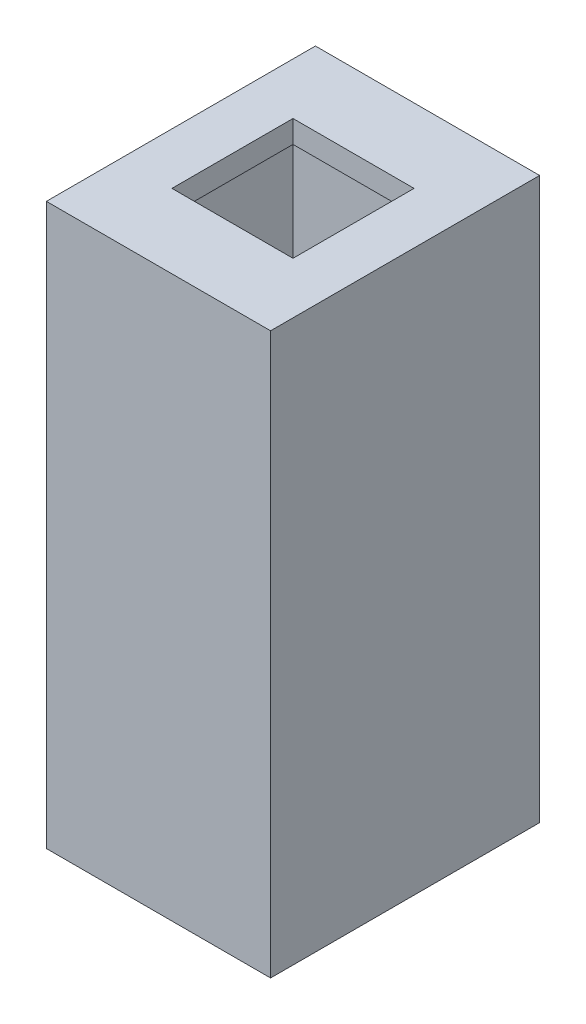
ISO-10303-21;
HEADER;
FILE_DESCRIPTION(('STEP AP214'),'2;1');
FILE_NAME('part.step','',(''),(''),'','','');
FILE_SCHEMA(('AUTOMOTIVE_DESIGN { 1 0 10303 214 1 1 1 1 }'));
ENDSEC;
DATA;
#1=APPLICATION_CONTEXT('core data for automotive mechanical design processes');
#2=APPLICATION_PROTOCOL_DEFINITION('international standard','automotive_design',2000,#1);
#3=PRODUCT_CONTEXT('',#1,'mechanical');
#4=PRODUCT('Part','Part','',(#3));
#5=PRODUCT_RELATED_PRODUCT_CATEGORY('part','',(#4));
#6=PRODUCT_DEFINITION_FORMATION('','',#4);
#7=PRODUCT_DEFINITION_CONTEXT('part definition',#1,'design');
#8=PRODUCT_DEFINITION('design','',#6,#7);
#9=PRODUCT_DEFINITION_SHAPE('','',#8);
#10=(LENGTH_UNIT() NAMED_UNIT(*) SI_UNIT(.MILLI.,.METRE.));
#11=(NAMED_UNIT(*) PLANE_ANGLE_UNIT() SI_UNIT($,.RADIAN.));
#12=(NAMED_UNIT(*) SI_UNIT($,.STERADIAN.) SOLID_ANGLE_UNIT());
#13=UNCERTAINTY_MEASURE_WITH_UNIT(LENGTH_MEASURE(1.E-05),#10,'distance_accuracy_value','');
#14=(GEOMETRIC_REPRESENTATION_CONTEXT(3) GLOBAL_UNCERTAINTY_ASSIGNED_CONTEXT((#13)) GLOBAL_UNIT_ASSIGNED_CONTEXT((#10,
#11,#12)) REPRESENTATION_CONTEXT('',''));
#15=CARTESIAN_POINT('',(0.,0.,0.));
#16=DIRECTION('',(0.,0.,1.));
#17=DIRECTION('',(1.,0.,0.));
#18=AXIS2_PLACEMENT_3D('',#15,#16,#17);
#19=CARTESIAN_POINT('',(0.,25.,-3.1));
#20=DIRECTION('',(0.,0.,-1.));
#21=DIRECTION('',(-1.,0.,0.));
#22=AXIS2_PLACEMENT_3D('',#19,#20,#21);
#23=PLANE('',#22);
#24=DIRECTION('',(0.,-1.,0.));
#25=VECTOR('',#24,1.);
#26=CARTESIAN_POINT('',(3.1,25.,-3.1));
#27=LINE('',#26,#25);
#28=CARTESIAN_POINT('',(3.1,24.,-3.1));
#29=VERTEX_POINT('',#28);
#30=CARTESIAN_POINT('',(3.1,0.,-3.1));
#31=VERTEX_POINT('',#30);
#32=EDGE_CURVE('E73',#29,#31,#27,.T.);
#33=ORIENTED_EDGE('',*,*,#32,.F.);
#34=DIRECTION('',(-1.,0.,0.));
#35=VECTOR('',#34,1.);
#36=CARTESIAN_POINT('',(0.,24.,-3.1));
#37=LINE('',#36,#35);
#38=CARTESIAN_POINT('',(-3.1,24.,-3.1));
#39=VERTEX_POINT('',#38);
#40=EDGE_CURVE('E203',#29,#39,#37,.T.);
#41=ORIENTED_EDGE('',*,*,#40,.T.);
#42=DIRECTION('',(0.,-1.,0.));
#43=VECTOR('',#42,1.);
#44=CARTESIAN_POINT('',(-3.1,25.,-3.1));
#45=LINE('',#44,#43);
#46=CARTESIAN_POINT('',(-3.1,0.,-3.1));
#47=VERTEX_POINT('',#46);
#48=EDGE_CURVE('E241',#39,#47,#45,.T.);
#49=ORIENTED_EDGE('',*,*,#48,.T.);
#50=DIRECTION('',(1.,0.,0.));
#51=VECTOR('',#50,1.);
#52=CARTESIAN_POINT('',(0.,0.,-3.1));
#53=LINE('',#52,#51);
#54=EDGE_CURVE('E230',#47,#31,#53,.T.);
#55=ORIENTED_EDGE('',*,*,#54,.T.);
#56=EDGE_LOOP('',(#33,#41,#49,#55));
#57=FACE_BOUND('',#56,.T.);
#58=ADVANCED_FACE('F65',(#57),#23,.F.);
#59=CARTESIAN_POINT('',(3.1,25.,0.));
#60=DIRECTION('',(1.,0.,0.));
#61=DIRECTION('',(0.,0.,-1.));
#62=AXIS2_PLACEMENT_3D('',#59,#60,#61);
#63=PLANE('',#62);
#64=DIRECTION('',(0.,-1.,0.));
#65=VECTOR('',#64,1.);
#66=CARTESIAN_POINT('',(3.1,25.,3.1));
#67=LINE('',#66,#65);
#68=CARTESIAN_POINT('',(3.1,24.,3.1));
#69=VERTEX_POINT('',#68);
#70=CARTESIAN_POINT('',(3.1,0.,3.1));
#71=VERTEX_POINT('',#70);
#72=EDGE_CURVE('E246',#69,#71,#67,.T.);
#73=ORIENTED_EDGE('',*,*,#72,.F.);
#74=DIRECTION('',(0.,0.,-1.));
#75=VECTOR('',#74,1.);
#76=CARTESIAN_POINT('',(3.1,24.,0.));
#77=LINE('',#76,#75);
#78=EDGE_CURVE('E80',#69,#29,#77,.T.);
#79=ORIENTED_EDGE('',*,*,#78,.T.);
#80=ORIENTED_EDGE('',*,*,#32,.T.);
#81=DIRECTION('',(0.,0.,1.));
#82=VECTOR('',#81,1.);
#83=CARTESIAN_POINT('',(3.1,0.,0.));
#84=LINE('',#83,#82);
#85=EDGE_CURVE('E233',#31,#71,#84,.T.);
#86=ORIENTED_EDGE('',*,*,#85,.T.);
#87=EDGE_LOOP('',(#73,#79,#80,#86));
#88=FACE_BOUND('',#87,.T.);
#89=ADVANCED_FACE('F288',(#88),#63,.F.);
#90=CARTESIAN_POINT('',(0.,25.,3.1));
#91=DIRECTION('',(0.,0.,-1.));
#92=DIRECTION('',(-1.,0.,0.));
#93=AXIS2_PLACEMENT_3D('',#90,#91,#92);
#94=PLANE('',#93);
#95=DIRECTION('',(-1.,0.,0.));
#96=VECTOR('',#95,1.);
#97=CARTESIAN_POINT('',(0.,24.,3.1));
#98=LINE('',#97,#96);
#99=CARTESIAN_POINT('',(-3.1,24.,3.1));
#100=VERTEX_POINT('',#99);
#101=EDGE_CURVE('E88',#69,#100,#98,.T.);
#102=ORIENTED_EDGE('',*,*,#101,.F.);
#103=ORIENTED_EDGE('',*,*,#72,.T.);
#104=DIRECTION('',(1.,0.,0.));
#105=VECTOR('',#104,1.);
#106=CARTESIAN_POINT('',(0.,0.,3.1));
#107=LINE('',#106,#105);
#108=CARTESIAN_POINT('',(-3.1,0.,3.1));
#109=VERTEX_POINT('',#108);
#110=EDGE_CURVE('E236',#109,#71,#107,.T.);
#111=ORIENTED_EDGE('',*,*,#110,.F.);
#112=DIRECTION('',(0.,-1.,0.));
#113=VECTOR('',#112,1.);
#114=CARTESIAN_POINT('',(-3.1,25.,3.1));
#115=LINE('',#114,#113);
#116=EDGE_CURVE('E243',#100,#109,#115,.T.);
#117=ORIENTED_EDGE('',*,*,#116,.F.);
#118=EDGE_LOOP('',(#102,#103,#111,#117));
#119=FACE_BOUND('',#118,.T.);
#120=ADVANCED_FACE('F293',(#119),#94,.T.);
#121=CARTESIAN_POINT('',(5.,25.,0.));
#122=DIRECTION('',(1.,0.,0.));
#123=DIRECTION('',(0.,0.,-1.));
#124=AXIS2_PLACEMENT_3D('',#121,#122,#123);
#125=PLANE('',#124);
#126=DIRECTION('',(0.,0.,1.));
#127=VECTOR('',#126,1.);
#128=CARTESIAN_POINT('',(5.,0.,0.));
#129=LINE('',#128,#127);
#130=CARTESIAN_POINT('',(5.,0.,-6.));
#131=VERTEX_POINT('',#130);
#132=CARTESIAN_POINT('',(5.,0.,6.));
#133=VERTEX_POINT('',#132);
#134=EDGE_CURVE('E206',#131,#133,#129,.T.);
#135=ORIENTED_EDGE('',*,*,#134,.F.);
#136=DIRECTION('',(0.,-1.,0.));
#137=VECTOR('',#136,1.);
#138=CARTESIAN_POINT('',(5.,25.,-6.));
#139=LINE('',#138,#137);
#140=CARTESIAN_POINT('',(5.,25.,-6.));
#141=VERTEX_POINT('',#140);
#142=EDGE_CURVE('E244',#141,#131,#139,.T.);
#143=ORIENTED_EDGE('',*,*,#142,.F.);
#144=DIRECTION('',(0.,0.,1.));
#145=VECTOR('',#144,1.);
#146=CARTESIAN_POINT('',(5.,25.,0.));
#147=LINE('',#146,#145);
#148=CARTESIAN_POINT('',(5.,25.,6.));
#149=VERTEX_POINT('',#148);
#150=EDGE_CURVE('E207',#141,#149,#147,.T.);
#151=ORIENTED_EDGE('',*,*,#150,.T.);
#152=DIRECTION('',(0.,-1.,0.));
#153=VECTOR('',#152,1.);
#154=CARTESIAN_POINT('',(5.,25.,6.));
#155=LINE('',#154,#153);
#156=EDGE_CURVE('E218',#149,#133,#155,.T.);
#157=ORIENTED_EDGE('',*,*,#156,.T.);
#158=EDGE_LOOP('',(#135,#143,#151,#157));
#159=FACE_BOUND('',#158,.T.);
#160=ADVANCED_FACE('F67',(#159),#125,.T.);
#161=CARTESIAN_POINT('',(0.,25.,-6.));
#162=DIRECTION('',(0.,0.,-1.));
#163=DIRECTION('',(-1.,0.,0.));
#164=AXIS2_PLACEMENT_3D('',#161,#162,#163);
#165=PLANE('',#164);
#166=DIRECTION('',(1.,0.,0.));
#167=VECTOR('',#166,1.);
#168=CARTESIAN_POINT('',(0.,0.,-6.));
#169=LINE('',#168,#167);
#170=CARTESIAN_POINT('',(-5.,0.,-6.));
#171=VERTEX_POINT('',#170);
#172=EDGE_CURVE('E221',#171,#131,#169,.T.);
#173=ORIENTED_EDGE('',*,*,#172,.F.);
#174=DIRECTION('',(0.,-1.,0.));
#175=VECTOR('',#174,1.);
#176=CARTESIAN_POINT('',(-5.,25.,-6.));
#177=LINE('',#176,#175);
#178=CARTESIAN_POINT('',(-5.,25.,-6.));
#179=VERTEX_POINT('',#178);
#180=EDGE_CURVE('E252',#179,#171,#177,.T.);
#181=ORIENTED_EDGE('',*,*,#180,.F.);
#182=DIRECTION('',(1.,0.,0.));
#183=VECTOR('',#182,1.);
#184=CARTESIAN_POINT('',(0.,25.,-6.));
#185=LINE('',#184,#183);
#186=EDGE_CURVE('E210',#179,#141,#185,.T.);
#187=ORIENTED_EDGE('',*,*,#186,.T.);
#188=ORIENTED_EDGE('',*,*,#142,.T.);
#189=EDGE_LOOP('',(#173,#181,#187,#188));
#190=FACE_BOUND('',#189,.T.);
#191=ADVANCED_FACE('F256',(#190),#165,.T.);
#192=CARTESIAN_POINT('',(-5.,25.,0.));
#193=DIRECTION('',(1.,0.,0.));
#194=DIRECTION('',(0.,0.,-1.));
#195=AXIS2_PLACEMENT_3D('',#192,#193,#194);
#196=PLANE('',#195);
#197=DIRECTION('',(0.,0.,1.));
#198=VECTOR('',#197,1.);
#199=CARTESIAN_POINT('',(-5.,0.,0.));
#200=LINE('',#199,#198);
#201=CARTESIAN_POINT('',(-5.,0.,6.));
#202=VERTEX_POINT('',#201);
#203=EDGE_CURVE('E224',#171,#202,#200,.T.);
#204=ORIENTED_EDGE('',*,*,#203,.T.);
#205=DIRECTION('',(0.,-1.,0.));
#206=VECTOR('',#205,1.);
#207=CARTESIAN_POINT('',(-5.,25.,6.));
#208=LINE('',#207,#206);
#209=CARTESIAN_POINT('',(-5.,25.,6.));
#210=VERTEX_POINT('',#209);
#211=EDGE_CURVE('E250',#210,#202,#208,.T.);
#212=ORIENTED_EDGE('',*,*,#211,.F.);
#213=DIRECTION('',(0.,0.,1.));
#214=VECTOR('',#213,1.);
#215=CARTESIAN_POINT('',(-5.,25.,0.));
#216=LINE('',#215,#214);
#217=EDGE_CURVE('E214',#179,#210,#216,.T.);
#218=ORIENTED_EDGE('',*,*,#217,.F.);
#219=ORIENTED_EDGE('',*,*,#180,.T.);
#220=EDGE_LOOP('',(#204,#212,#218,#219));
#221=FACE_BOUND('',#220,.T.);
#222=ADVANCED_FACE('F268',(#221),#196,.F.);
#223=CARTESIAN_POINT('',(0.,25.,6.));
#224=DIRECTION('',(0.,0.,-1.));
#225=DIRECTION('',(-1.,0.,0.));
#226=AXIS2_PLACEMENT_3D('',#223,#224,#225);
#227=PLANE('',#226);
#228=DIRECTION('',(1.,0.,0.));
#229=VECTOR('',#228,1.);
#230=CARTESIAN_POINT('',(0.,0.,6.));
#231=LINE('',#230,#229);
#232=EDGE_CURVE('E227',#202,#133,#231,.T.);
#233=ORIENTED_EDGE('',*,*,#232,.T.);
#234=ORIENTED_EDGE('',*,*,#156,.F.);
#235=DIRECTION('',(1.,0.,0.));
#236=VECTOR('',#235,1.);
#237=CARTESIAN_POINT('',(0.,25.,6.));
#238=LINE('',#237,#236);
#239=EDGE_CURVE('E216',#210,#149,#238,.T.);
#240=ORIENTED_EDGE('',*,*,#239,.F.);
#241=ORIENTED_EDGE('',*,*,#211,.T.);
#242=EDGE_LOOP('',(#233,#234,#240,#241));
#243=FACE_BOUND('',#242,.T.);
#244=ADVANCED_FACE('F275',(#243),#227,.F.);
#245=CARTESIAN_POINT('',(-3.1,25.,0.));
#246=DIRECTION('',(1.,0.,0.));
#247=DIRECTION('',(0.,0.,-1.));
#248=AXIS2_PLACEMENT_3D('',#245,#246,#247);
#249=PLANE('',#248);
#250=DIRECTION('',(0.,0.,-1.));
#251=VECTOR('',#250,1.);
#252=CARTESIAN_POINT('',(-3.1,24.,0.));
#253=LINE('',#252,#251);
#254=EDGE_CURVE('E12',#100,#39,#253,.T.);
#255=ORIENTED_EDGE('',*,*,#254,.F.);
#256=ORIENTED_EDGE('',*,*,#116,.T.);
#257=DIRECTION('',(0.,0.,1.));
#258=VECTOR('',#257,1.);
#259=CARTESIAN_POINT('',(-3.1,0.,0.));
#260=LINE('',#259,#258);
#261=EDGE_CURVE('E211',#47,#109,#260,.T.);
#262=ORIENTED_EDGE('',*,*,#261,.F.);
#263=ORIENTED_EDGE('',*,*,#48,.F.);
#264=EDGE_LOOP('',(#255,#256,#262,#263));
#265=FACE_BOUND('',#264,.T.);
#266=ADVANCED_FACE('F277',(#265),#249,.T.);
#267=CARTESIAN_POINT('',(0.,25.,0.));
#268=DIRECTION('',(0.,1.,0.));
#269=DIRECTION('',(0.,0.,1.));
#270=AXIS2_PLACEMENT_3D('',#267,#268,#269);
#271=PLANE('',#270);
#272=ORIENTED_EDGE('',*,*,#150,.F.);
#273=ORIENTED_EDGE('',*,*,#186,.F.);
#274=ORIENTED_EDGE('',*,*,#217,.T.);
#275=ORIENTED_EDGE('',*,*,#239,.T.);
#276=EDGE_LOOP('',(#272,#273,#274,#275));
#277=FACE_BOUND('',#276,.T.);
#278=DIRECTION('',(0.,0.,1.));
#279=VECTOR('',#278,1.);
#280=CARTESIAN_POINT('',(-2.7,25.,0.));
#281=LINE('',#280,#279);
#282=CARTESIAN_POINT('',(-2.7,25.,-2.7));
#283=VERTEX_POINT('',#282);
#284=CARTESIAN_POINT('',(-2.7,25.,2.7));
#285=VERTEX_POINT('',#284);
#286=EDGE_CURVE('E191',#283,#285,#281,.T.);
#287=ORIENTED_EDGE('',*,*,#286,.F.);
#288=DIRECTION('',(-1.,0.,0.));
#289=VECTOR('',#288,1.);
#290=CARTESIAN_POINT('',(0.,25.,-2.7));
#291=LINE('',#290,#289);
#292=CARTESIAN_POINT('',(2.7,25.,-2.7));
#293=VERTEX_POINT('',#292);
#294=EDGE_CURVE('E162',#293,#283,#291,.T.);
#295=ORIENTED_EDGE('',*,*,#294,.F.);
#296=DIRECTION('',(0.,0.,1.));
#297=VECTOR('',#296,1.);
#298=CARTESIAN_POINT('',(2.7,25.,0.));
#299=LINE('',#298,#297);
#300=CARTESIAN_POINT('',(2.7,25.,2.7));
#301=VERTEX_POINT('',#300);
#302=EDGE_CURVE('E179',#293,#301,#299,.T.);
#303=ORIENTED_EDGE('',*,*,#302,.T.);
#304=DIRECTION('',(-1.,0.,0.));
#305=VECTOR('',#304,1.);
#306=CARTESIAN_POINT('',(0.,25.,2.7));
#307=LINE('',#306,#305);
#308=EDGE_CURVE('E182',#301,#285,#307,.T.);
#309=ORIENTED_EDGE('',*,*,#308,.T.);
#310=EDGE_LOOP('',(#287,#295,#303,#309));
#311=FACE_BOUND('',#310,.T.);
#312=ADVANCED_FACE('F272',(#277,#311),#271,.T.);
#313=CARTESIAN_POINT('',(0.,0.,0.));
#314=DIRECTION('',(0.,1.,0.));
#315=DIRECTION('',(0.,0.,1.));
#316=AXIS2_PLACEMENT_3D('',#313,#314,#315);
#317=PLANE('',#316);
#318=CARTESIAN_POINT('',(3.74999999999999,0.,4.5));
#319=DIRECTION('',(0.,-1.,0.));
#320=DIRECTION('',(0.,0.,-1.));
#321=AXIS2_PLACEMENT_3D('',#318,#319,#320);
#322=CIRCLE('',#321,0.3);
#323=CARTESIAN_POINT('',(3.74999999999999,0.,4.2));
#324=VERTEX_POINT('',#323);
#325=EDGE_CURVE('E365',#324,#324,#322,.T.);
#326=ORIENTED_EDGE('',*,*,#325,.F.);
#327=EDGE_LOOP('',(#326));
#328=FACE_BOUND('',#327,.T.);
#329=CARTESIAN_POINT('',(-3.75,0.,-4.5));
#330=DIRECTION('',(0.,-1.,0.));
#331=DIRECTION('',(0.,0.,-1.));
#332=AXIS2_PLACEMENT_3D('',#329,#330,#331);
#333=CIRCLE('',#332,0.3);
#334=CARTESIAN_POINT('',(-3.75,0.,-4.8));
#335=VERTEX_POINT('',#334);
#336=EDGE_CURVE('E361',#335,#335,#333,.T.);
#337=ORIENTED_EDGE('',*,*,#336,.F.);
#338=EDGE_LOOP('',(#337));
#339=FACE_BOUND('',#338,.T.);
#340=CARTESIAN_POINT('',(3.74999999999999,0.,-4.5));
#341=DIRECTION('',(0.,-1.,0.));
#342=DIRECTION('',(0.,0.,-1.));
#343=AXIS2_PLACEMENT_3D('',#340,#341,#342);
#344=CIRCLE('',#343,0.3);
#345=CARTESIAN_POINT('',(3.74999999999999,0.,-4.8));
#346=VERTEX_POINT('',#345);
#347=EDGE_CURVE('E356',#346,#346,#344,.T.);
#348=ORIENTED_EDGE('',*,*,#347,.F.);
#349=EDGE_LOOP('',(#348));
#350=FACE_BOUND('',#349,.T.);
#351=CARTESIAN_POINT('',(-3.75,0.,4.5));
#352=DIRECTION('',(0.,-1.,0.));
#353=DIRECTION('',(0.,0.,-1.));
#354=AXIS2_PLACEMENT_3D('',#351,#352,#353);
#355=CIRCLE('',#354,0.3);
#356=CARTESIAN_POINT('',(-3.75,0.,4.2));
#357=VERTEX_POINT('',#356);
#358=EDGE_CURVE('E185',#357,#357,#355,.T.);
#359=ORIENTED_EDGE('',*,*,#358,.F.);
#360=EDGE_LOOP('',(#359));
#361=FACE_BOUND('',#360,.T.);
#362=ORIENTED_EDGE('',*,*,#134,.T.);
#363=ORIENTED_EDGE('',*,*,#232,.F.);
#364=ORIENTED_EDGE('',*,*,#203,.F.);
#365=ORIENTED_EDGE('',*,*,#172,.T.);
#366=EDGE_LOOP('',(#362,#363,#364,#365));
#367=FACE_BOUND('',#366,.T.);
#368=ORIENTED_EDGE('',*,*,#54,.F.);
#369=ORIENTED_EDGE('',*,*,#261,.T.);
#370=ORIENTED_EDGE('',*,*,#110,.T.);
#371=ORIENTED_EDGE('',*,*,#85,.F.);
#372=EDGE_LOOP('',(#368,#369,#370,#371));
#373=FACE_BOUND('',#372,.T.);
#374=ADVANCED_FACE('F264',(#328,#339,#350,#361,#367,#373),#317,.F.);
#375=CARTESIAN_POINT('',(0.,24.,0.));
#376=DIRECTION('',(0.,-1.,0.));
#377=DIRECTION('',(0.,0.,-1.));
#378=AXIS2_PLACEMENT_3D('',#375,#376,#377);
#379=PLANE('',#378);
#380=DIRECTION('',(-1.,0.,0.));
#381=VECTOR('',#380,1.);
#382=CARTESIAN_POINT('',(0.,24.,-2.7));
#383=LINE('',#382,#381);
#384=CARTESIAN_POINT('',(2.7,24.,-2.7));
#385=VERTEX_POINT('',#384);
#386=CARTESIAN_POINT('',(-2.7,24.,-2.7));
#387=VERTEX_POINT('',#386);
#388=EDGE_CURVE('E159',#385,#387,#383,.T.);
#389=ORIENTED_EDGE('',*,*,#388,.T.);
#390=DIRECTION('',(0.,0.,1.));
#391=VECTOR('',#390,1.);
#392=CARTESIAN_POINT('',(-2.7,24.,0.));
#393=LINE('',#392,#391);
#394=CARTESIAN_POINT('',(-2.7,24.,2.7));
#395=VERTEX_POINT('',#394);
#396=EDGE_CURVE('E170',#387,#395,#393,.T.);
#397=ORIENTED_EDGE('',*,*,#396,.T.);
#398=DIRECTION('',(-1.,0.,0.));
#399=VECTOR('',#398,1.);
#400=CARTESIAN_POINT('',(0.,24.,2.7));
#401=LINE('',#400,#399);
#402=CARTESIAN_POINT('',(2.7,24.,2.7));
#403=VERTEX_POINT('',#402);
#404=EDGE_CURVE('E175',#403,#395,#401,.T.);
#405=ORIENTED_EDGE('',*,*,#404,.F.);
#406=DIRECTION('',(0.,0.,1.));
#407=VECTOR('',#406,1.);
#408=CARTESIAN_POINT('',(2.7,24.,0.));
#409=LINE('',#408,#407);
#410=EDGE_CURVE('E167',#385,#403,#409,.T.);
#411=ORIENTED_EDGE('',*,*,#410,.F.);
#412=EDGE_LOOP('',(#389,#397,#405,#411));
#413=FACE_BOUND('',#412,.T.);
#414=ORIENTED_EDGE('',*,*,#40,.F.);
#415=ORIENTED_EDGE('',*,*,#78,.F.);
#416=ORIENTED_EDGE('',*,*,#101,.T.);
#417=ORIENTED_EDGE('',*,*,#254,.T.);
#418=EDGE_LOOP('',(#414,#415,#416,#417));
#419=FACE_BOUND('',#418,.T.);
#420=ADVANCED_FACE('F177',(#413,#419),#379,.T.);
#421=CARTESIAN_POINT('',(0.,24.,-2.7));
#422=DIRECTION('',(0.,0.,-1.));
#423=DIRECTION('',(-1.,0.,0.));
#424=AXIS2_PLACEMENT_3D('',#421,#422,#423);
#425=PLANE('',#424);
#426=ORIENTED_EDGE('',*,*,#294,.T.);
#427=DIRECTION('',(0.,1.,0.));
#428=VECTOR('',#427,1.);
#429=CARTESIAN_POINT('',(-2.7,24.,-2.7));
#430=LINE('',#429,#428);
#431=EDGE_CURVE('E155',#387,#283,#430,.T.);
#432=ORIENTED_EDGE('',*,*,#431,.F.);
#433=ORIENTED_EDGE('',*,*,#388,.F.);
#434=DIRECTION('',(0.,1.,0.));
#435=VECTOR('',#434,1.);
#436=CARTESIAN_POINT('',(2.7,24.,-2.7));
#437=LINE('',#436,#435);
#438=EDGE_CURVE('E196',#385,#293,#437,.T.);
#439=ORIENTED_EDGE('',*,*,#438,.T.);
#440=EDGE_LOOP('',(#426,#432,#433,#439));
#441=FACE_BOUND('',#440,.T.);
#442=ADVANCED_FACE('F157',(#441),#425,.F.);
#443=CARTESIAN_POINT('',(2.7,24.,0.));
#444=DIRECTION('',(-1.,0.,0.));
#445=DIRECTION('',(0.,0.,1.));
#446=AXIS2_PLACEMENT_3D('',#443,#444,#445);
#447=PLANE('',#446);
#448=ORIENTED_EDGE('',*,*,#302,.F.);
#449=ORIENTED_EDGE('',*,*,#438,.F.);
#450=ORIENTED_EDGE('',*,*,#410,.T.);
#451=DIRECTION('',(0.,1.,0.));
#452=VECTOR('',#451,1.);
#453=CARTESIAN_POINT('',(2.7,24.,2.7));
#454=LINE('',#453,#452);
#455=EDGE_CURVE('E198',#403,#301,#454,.T.);
#456=ORIENTED_EDGE('',*,*,#455,.T.);
#457=EDGE_LOOP('',(#448,#449,#450,#456));
#458=FACE_BOUND('',#457,.T.);
#459=ADVANCED_FACE('F307',(#458),#447,.T.);
#460=CARTESIAN_POINT('',(0.,24.,2.7));
#461=DIRECTION('',(0.,0.,-1.));
#462=DIRECTION('',(-1.,0.,0.));
#463=AXIS2_PLACEMENT_3D('',#460,#461,#462);
#464=PLANE('',#463);
#465=ORIENTED_EDGE('',*,*,#308,.F.);
#466=ORIENTED_EDGE('',*,*,#455,.F.);
#467=ORIENTED_EDGE('',*,*,#404,.T.);
#468=DIRECTION('',(0.,1.,0.));
#469=VECTOR('',#468,1.);
#470=CARTESIAN_POINT('',(-2.7,24.,2.7));
#471=LINE('',#470,#469);
#472=EDGE_CURVE('E166',#395,#285,#471,.T.);
#473=ORIENTED_EDGE('',*,*,#472,.T.);
#474=EDGE_LOOP('',(#465,#466,#467,#473));
#475=FACE_BOUND('',#474,.T.);
#476=ADVANCED_FACE('F311',(#475),#464,.T.);
#477=CARTESIAN_POINT('',(-2.7,24.,0.));
#478=DIRECTION('',(-1.,0.,0.));
#479=DIRECTION('',(0.,0.,1.));
#480=AXIS2_PLACEMENT_3D('',#477,#478,#479);
#481=PLANE('',#480);
#482=ORIENTED_EDGE('',*,*,#286,.T.);
#483=ORIENTED_EDGE('',*,*,#472,.F.);
#484=ORIENTED_EDGE('',*,*,#396,.F.);
#485=ORIENTED_EDGE('',*,*,#431,.T.);
#486=EDGE_LOOP('',(#482,#483,#484,#485));
#487=FACE_BOUND('',#486,.T.);
#488=ADVANCED_FACE('F171',(#487),#481,.F.);
#489=CARTESIAN_POINT('',(-3.75,2.,4.5));
#490=DIRECTION('',(0.,-1.,0.));
#491=DIRECTION('',(0.,0.,-1.));
#492=AXIS2_PLACEMENT_3D('',#489,#490,#491);
#493=CYLINDRICAL_SURFACE('',#492,0.3);
#494=CARTESIAN_POINT('',(-3.75,2.,4.5));
#495=DIRECTION('',(0.,-1.,0.));
#496=DIRECTION('',(0.,0.,-1.));
#497=AXIS2_PLACEMENT_3D('',#494,#495,#496);
#498=CIRCLE('',#497,0.3);
#499=CARTESIAN_POINT('',(-3.75,2.,4.2));
#500=VERTEX_POINT('',#499);
#501=EDGE_CURVE('E192',#500,#500,#498,.T.);
#502=ORIENTED_EDGE('',*,*,#501,.F.);
#503=EDGE_LOOP('',(#502));
#504=FACE_BOUND('',#503,.T.);
#505=ORIENTED_EDGE('',*,*,#358,.T.);
#506=EDGE_LOOP('',(#505));
#507=FACE_BOUND('',#506,.T.);
#508=ADVANCED_FACE('F310',(#504,#507),#493,.F.);
#509=CARTESIAN_POINT('',(-3.75,2.,4.5));
#510=DIRECTION('',(0.,-1.,0.));
#511=DIRECTION('',(0.,0.,-1.));
#512=AXIS2_PLACEMENT_3D('',#509,#510,#511);
#513=PLANE('',#512);
#514=ORIENTED_EDGE('',*,*,#501,.T.);
#515=EDGE_LOOP('',(#514));
#516=FACE_BOUND('',#515,.T.);
#517=ADVANCED_FACE('F320',(#516),#513,.T.);
#518=CARTESIAN_POINT('',(3.74999999999999,2.,-4.5));
#519=DIRECTION('',(0.,-1.,0.));
#520=DIRECTION('',(0.,0.,-1.));
#521=AXIS2_PLACEMENT_3D('',#518,#519,#520);
#522=CYLINDRICAL_SURFACE('',#521,0.3);
#523=CARTESIAN_POINT('',(3.74999999999999,2.,-4.5));
#524=DIRECTION('',(0.,-1.,0.));
#525=DIRECTION('',(0.,0.,-1.));
#526=AXIS2_PLACEMENT_3D('',#523,#524,#525);
#527=CIRCLE('',#526,0.3);
#528=CARTESIAN_POINT('',(3.74999999999999,2.,-4.8));
#529=VERTEX_POINT('',#528);
#530=EDGE_CURVE('E353',#529,#529,#527,.T.);
#531=ORIENTED_EDGE('',*,*,#530,.F.);
#532=EDGE_LOOP('',(#531));
#533=FACE_BOUND('',#532,.T.);
#534=ORIENTED_EDGE('',*,*,#347,.T.);
#535=EDGE_LOOP('',(#534));
#536=FACE_BOUND('',#535,.T.);
#537=ADVANCED_FACE('F324',(#533,#536),#522,.F.);
#538=CARTESIAN_POINT('',(3.74999999999999,2.,-4.5));
#539=DIRECTION('',(0.,-1.,0.));
#540=DIRECTION('',(0.,0.,-1.));
#541=AXIS2_PLACEMENT_3D('',#538,#539,#540);
#542=PLANE('',#541);
#543=ORIENTED_EDGE('',*,*,#530,.T.);
#544=EDGE_LOOP('',(#543));
#545=FACE_BOUND('',#544,.T.);
#546=ADVANCED_FACE('F334',(#545),#542,.T.);
#547=CARTESIAN_POINT('',(-3.75,2.,-4.5));
#548=DIRECTION('',(0.,-1.,0.));
#549=DIRECTION('',(0.,0.,-1.));
#550=AXIS2_PLACEMENT_3D('',#547,#548,#549);
#551=CYLINDRICAL_SURFACE('',#550,0.3);
#552=CARTESIAN_POINT('',(-3.75,2.,-4.5));
#553=DIRECTION('',(0.,-1.,0.));
#554=DIRECTION('',(0.,0.,-1.));
#555=AXIS2_PLACEMENT_3D('',#552,#553,#554);
#556=CIRCLE('',#555,0.3);
#557=CARTESIAN_POINT('',(-3.75,2.,-4.8));
#558=VERTEX_POINT('',#557);
#559=EDGE_CURVE('E358',#558,#558,#556,.T.);
#560=ORIENTED_EDGE('',*,*,#559,.F.);
#561=EDGE_LOOP('',(#560));
#562=FACE_BOUND('',#561,.T.);
#563=ORIENTED_EDGE('',*,*,#336,.T.);
#564=EDGE_LOOP('',(#563));
#565=FACE_BOUND('',#564,.T.);
#566=ADVANCED_FACE('F330',(#562,#565),#551,.F.);
#567=CARTESIAN_POINT('',(-3.75,2.,-4.5));
#568=DIRECTION('',(0.,-1.,0.));
#569=DIRECTION('',(0.,0.,-1.));
#570=AXIS2_PLACEMENT_3D('',#567,#568,#569);
#571=PLANE('',#570);
#572=ORIENTED_EDGE('',*,*,#559,.T.);
#573=EDGE_LOOP('',(#572));
#574=FACE_BOUND('',#573,.T.);
#575=ADVANCED_FACE('F326',(#574),#571,.T.);
#576=CARTESIAN_POINT('',(3.74999999999999,2.,4.5));
#577=DIRECTION('',(0.,-1.,0.));
#578=DIRECTION('',(0.,0.,-1.));
#579=AXIS2_PLACEMENT_3D('',#576,#577,#578);
#580=CYLINDRICAL_SURFACE('',#579,0.3);
#581=CARTESIAN_POINT('',(3.74999999999999,2.,4.5));
#582=DIRECTION('',(0.,-1.,0.));
#583=DIRECTION('',(0.,0.,-1.));
#584=AXIS2_PLACEMENT_3D('',#581,#582,#583);
#585=CIRCLE('',#584,0.3);
#586=CARTESIAN_POINT('',(3.74999999999999,2.,4.2));
#587=VERTEX_POINT('',#586);
#588=EDGE_CURVE('E368',#587,#587,#585,.T.);
#589=ORIENTED_EDGE('',*,*,#588,.F.);
#590=EDGE_LOOP('',(#589));
#591=FACE_BOUND('',#590,.T.);
#592=ORIENTED_EDGE('',*,*,#325,.T.);
#593=EDGE_LOOP('',(#592));
#594=FACE_BOUND('',#593,.T.);
#595=ADVANCED_FACE('F329',(#591,#594),#580,.F.);
#596=CARTESIAN_POINT('',(3.74999999999999,2.,4.5));
#597=DIRECTION('',(0.,-1.,0.));
#598=DIRECTION('',(0.,0.,-1.));
#599=AXIS2_PLACEMENT_3D('',#596,#597,#598);
#600=PLANE('',#599);
#601=ORIENTED_EDGE('',*,*,#588,.T.);
#602=EDGE_LOOP('',(#601));
#603=FACE_BOUND('',#602,.T.);
#604=ADVANCED_FACE('F336',(#603),#600,.T.);
#605=CLOSED_SHELL('',(#58,#89,#120,#160,#191,#222,#244,#266,#312,#374,#420,#442,#459,#476,#488,
#508,#517,#537,#546,#566,#575,#595,#604));
#606=MANIFOLD_SOLID_BREP('B2',#605);
#607=ADVANCED_BREP_SHAPE_REPRESENTATION('',(#18,#606),#14);
#608=SHAPE_DEFINITION_REPRESENTATION(#9,#607);
ENDSEC;
END-ISO-10303-21;
